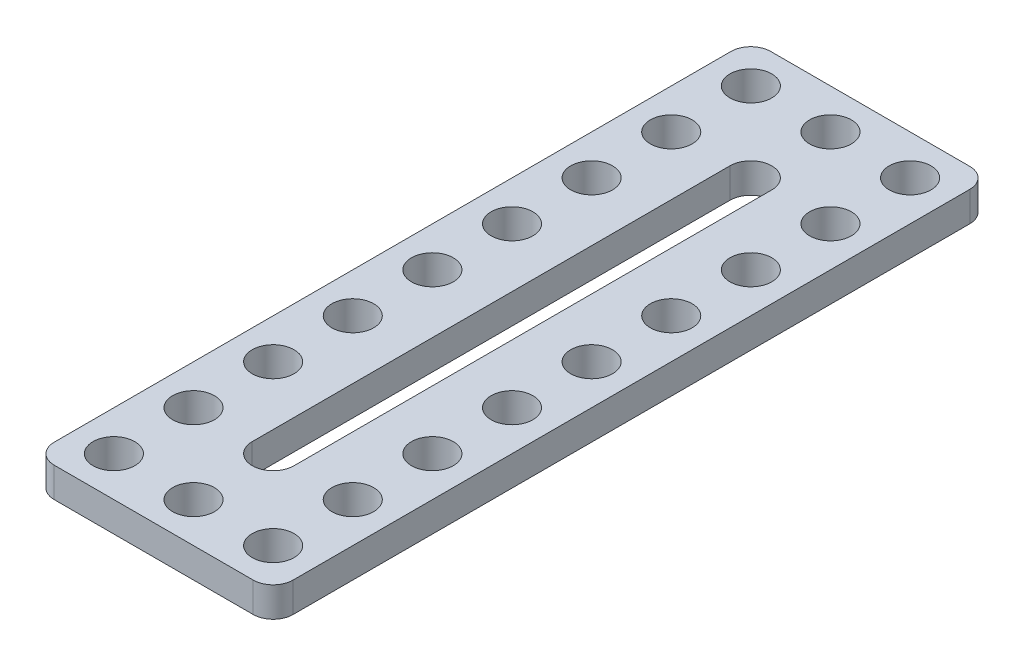
ISO-10303-21;
HEADER;
FILE_DESCRIPTION(('STEP AP214'),'2;1');
FILE_NAME('part.step','',(''),(''),'','','');
FILE_SCHEMA(('AUTOMOTIVE_DESIGN { 1 0 10303 214 1 1 1 1 }'));
ENDSEC;
DATA;
#1=APPLICATION_CONTEXT('core data for automotive mechanical design processes');
#2=APPLICATION_PROTOCOL_DEFINITION('international standard','automotive_design',2000,#1);
#3=PRODUCT_CONTEXT('',#1,'mechanical');
#4=PRODUCT('Part','Part','',(#3));
#5=PRODUCT_RELATED_PRODUCT_CATEGORY('part','',(#4));
#6=PRODUCT_DEFINITION_FORMATION('','',#4);
#7=PRODUCT_DEFINITION_CONTEXT('part definition',#1,'design');
#8=PRODUCT_DEFINITION('design','',#6,#7);
#9=PRODUCT_DEFINITION_SHAPE('','',#8);
#10=(LENGTH_UNIT() NAMED_UNIT(*) SI_UNIT(.MILLI.,.METRE.));
#11=(NAMED_UNIT(*) PLANE_ANGLE_UNIT() SI_UNIT($,.RADIAN.));
#12=(NAMED_UNIT(*) SI_UNIT($,.STERADIAN.) SOLID_ANGLE_UNIT());
#13=UNCERTAINTY_MEASURE_WITH_UNIT(LENGTH_MEASURE(1.E-05),#10,'distance_accuracy_value','');
#14=(GEOMETRIC_REPRESENTATION_CONTEXT(3) GLOBAL_UNCERTAINTY_ASSIGNED_CONTEXT((#13)) GLOBAL_UNIT_ASSIGNED_CONTEXT((#10,
#11,#12)) REPRESENTATION_CONTEXT('',''));
#15=CARTESIAN_POINT('',(0.,0.,0.));
#16=DIRECTION('',(0.,0.,1.));
#17=DIRECTION('',(1.,0.,0.));
#18=AXIS2_PLACEMENT_3D('',#15,#16,#17);
#19=CARTESIAN_POINT('',(12.,3.,-36.));
#20=DIRECTION('',(-1.,0.,0.));
#21=DIRECTION('',(0.,0.,1.));
#22=AXIS2_PLACEMENT_3D('',#19,#20,#21);
#23=PLANE('',#22);
#24=DIRECTION('',(0.,0.,-1.));
#25=VECTOR('',#24,1.);
#26=CARTESIAN_POINT('',(12.,3.,-36.));
#27=LINE('',#26,#25);
#28=CARTESIAN_POINT('',(12.,3.,34.));
#29=VERTEX_POINT('',#28);
#30=CARTESIAN_POINT('',(12.,3.,-34.));
#31=VERTEX_POINT('',#30);
#32=EDGE_CURVE('E291',#29,#31,#27,.T.);
#33=ORIENTED_EDGE('',*,*,#32,.F.);
#34=DIRECTION('',(0.,-1.,0.));
#35=VECTOR('',#34,1.);
#36=CARTESIAN_POINT('',(12.,3.,34.));
#37=LINE('',#36,#35);
#38=CARTESIAN_POINT('',(12.,0.,34.));
#39=VERTEX_POINT('',#38);
#40=EDGE_CURVE('E313',#29,#39,#37,.T.);
#41=ORIENTED_EDGE('',*,*,#40,.T.);
#42=DIRECTION('',(0.,0.,-1.));
#43=VECTOR('',#42,1.);
#44=CARTESIAN_POINT('',(12.,0.,-36.));
#45=LINE('',#44,#43);
#46=CARTESIAN_POINT('',(12.,0.,-34.));
#47=VERTEX_POINT('',#46);
#48=EDGE_CURVE('E288',#39,#47,#45,.T.);
#49=ORIENTED_EDGE('',*,*,#48,.T.);
#50=DIRECTION('',(0.,-1.,0.));
#51=VECTOR('',#50,1.);
#52=CARTESIAN_POINT('',(12.,3.,-34.));
#53=LINE('',#52,#51);
#54=EDGE_CURVE('E302',#47,#31,#53,.F.);
#55=ORIENTED_EDGE('',*,*,#54,.T.);
#56=EDGE_LOOP('',(#33,#41,#49,#55));
#57=FACE_BOUND('',#56,.T.);
#58=ADVANCED_FACE('F36',(#57),#23,.F.);
#59=CARTESIAN_POINT('',(-12.,3.,-36.));
#60=DIRECTION('',(0.,0.,1.));
#61=DIRECTION('',(1.,0.,0.));
#62=AXIS2_PLACEMENT_3D('',#59,#60,#61);
#63=PLANE('',#62);
#64=DIRECTION('',(-1.,0.,0.));
#65=VECTOR('',#64,1.);
#66=CARTESIAN_POINT('',(-12.,3.,-36.));
#67=LINE('',#66,#65);
#68=CARTESIAN_POINT('',(9.99999999999997,3.,-36.));
#69=VERTEX_POINT('',#68);
#70=CARTESIAN_POINT('',(-10.,3.,-36.));
#71=VERTEX_POINT('',#70);
#72=EDGE_CURVE('E294',#69,#71,#67,.T.);
#73=ORIENTED_EDGE('',*,*,#72,.F.);
#74=DIRECTION('',(0.,-1.,0.));
#75=VECTOR('',#74,1.);
#76=CARTESIAN_POINT('',(9.99999999999997,3.,-36.));
#77=LINE('',#76,#75);
#78=CARTESIAN_POINT('',(9.99999999999997,0.,-36.));
#79=VERTEX_POINT('',#78);
#80=EDGE_CURVE('E11',#69,#79,#77,.T.);
#81=ORIENTED_EDGE('',*,*,#80,.T.);
#82=DIRECTION('',(-1.,0.,0.));
#83=VECTOR('',#82,1.);
#84=CARTESIAN_POINT('',(-12.,0.,-36.));
#85=LINE('',#84,#83);
#86=CARTESIAN_POINT('',(-10.,0.,-36.));
#87=VERTEX_POINT('',#86);
#88=EDGE_CURVE('E305',#79,#87,#85,.T.);
#89=ORIENTED_EDGE('',*,*,#88,.T.);
#90=DIRECTION('',(0.,-1.,0.));
#91=VECTOR('',#90,1.);
#92=CARTESIAN_POINT('',(-10.,3.,-36.));
#93=LINE('',#92,#91);
#94=EDGE_CURVE('E44',#87,#71,#93,.F.);
#95=ORIENTED_EDGE('',*,*,#94,.T.);
#96=EDGE_LOOP('',(#73,#81,#89,#95));
#97=FACE_BOUND('',#96,.T.);
#98=ADVANCED_FACE('F342',(#97),#63,.F.);
#99=CARTESIAN_POINT('',(-12.,3.,-36.));
#100=DIRECTION('',(1.,0.,0.));
#101=DIRECTION('',(0.,0.,-1.));
#102=AXIS2_PLACEMENT_3D('',#99,#100,#101);
#103=PLANE('',#102);
#104=DIRECTION('',(0.,0.,1.));
#105=VECTOR('',#104,1.);
#106=CARTESIAN_POINT('',(-12.,0.,-36.));
#107=LINE('',#106,#105);
#108=CARTESIAN_POINT('',(-12.,0.,-34.));
#109=VERTEX_POINT('',#108);
#110=CARTESIAN_POINT('',(-12.,0.,34.));
#111=VERTEX_POINT('',#110);
#112=EDGE_CURVE('E308',#109,#111,#107,.T.);
#113=ORIENTED_EDGE('',*,*,#112,.T.);
#114=DIRECTION('',(0.,-1.,0.));
#115=VECTOR('',#114,1.);
#116=CARTESIAN_POINT('',(-12.,3.,34.));
#117=LINE('',#116,#115);
#118=CARTESIAN_POINT('',(-12.,3.,34.));
#119=VERTEX_POINT('',#118);
#120=EDGE_CURVE('E51',#111,#119,#117,.F.);
#121=ORIENTED_EDGE('',*,*,#120,.T.);
#122=DIRECTION('',(0.,0.,1.));
#123=VECTOR('',#122,1.);
#124=CARTESIAN_POINT('',(-12.,3.,-36.));
#125=LINE('',#124,#123);
#126=CARTESIAN_POINT('',(-12.,3.,-34.));
#127=VERTEX_POINT('',#126);
#128=EDGE_CURVE('E297',#127,#119,#125,.T.);
#129=ORIENTED_EDGE('',*,*,#128,.F.);
#130=DIRECTION('',(0.,-1.,0.));
#131=VECTOR('',#130,1.);
#132=CARTESIAN_POINT('',(-12.,3.,-34.));
#133=LINE('',#132,#131);
#134=EDGE_CURVE('E336',#127,#109,#133,.T.);
#135=ORIENTED_EDGE('',*,*,#134,.T.);
#136=EDGE_LOOP('',(#113,#121,#129,#135));
#137=FACE_BOUND('',#136,.T.);
#138=ADVANCED_FACE('F350',(#137),#103,.F.);
#139=CARTESIAN_POINT('',(-12.,3.,36.));
#140=DIRECTION('',(0.,0.,-1.));
#141=DIRECTION('',(-1.,0.,0.));
#142=AXIS2_PLACEMENT_3D('',#139,#140,#141);
#143=PLANE('',#142);
#144=DIRECTION('',(1.,0.,0.));
#145=VECTOR('',#144,1.);
#146=CARTESIAN_POINT('',(-12.,0.,36.));
#147=LINE('',#146,#145);
#148=CARTESIAN_POINT('',(-9.99999999999999,0.,36.));
#149=VERTEX_POINT('',#148);
#150=CARTESIAN_POINT('',(10.,0.,36.));
#151=VERTEX_POINT('',#150);
#152=EDGE_CURVE('E295',#149,#151,#147,.T.);
#153=ORIENTED_EDGE('',*,*,#152,.T.);
#154=DIRECTION('',(0.,-1.,0.));
#155=VECTOR('',#154,1.);
#156=CARTESIAN_POINT('',(10.,3.,36.));
#157=LINE('',#156,#155);
#158=CARTESIAN_POINT('',(10.,3.,36.));
#159=VERTEX_POINT('',#158);
#160=EDGE_CURVE('E327',#151,#159,#157,.F.);
#161=ORIENTED_EDGE('',*,*,#160,.T.);
#162=DIRECTION('',(1.,0.,0.));
#163=VECTOR('',#162,1.);
#164=CARTESIAN_POINT('',(-12.,3.,36.));
#165=LINE('',#164,#163);
#166=CARTESIAN_POINT('',(-9.99999999999999,3.,36.));
#167=VERTEX_POINT('',#166);
#168=EDGE_CURVE('E299',#167,#159,#165,.T.);
#169=ORIENTED_EDGE('',*,*,#168,.F.);
#170=DIRECTION('',(0.,-1.,0.));
#171=VECTOR('',#170,1.);
#172=CARTESIAN_POINT('',(-9.99999999999999,3.,36.));
#173=LINE('',#172,#171);
#174=EDGE_CURVE('E324',#167,#149,#173,.T.);
#175=ORIENTED_EDGE('',*,*,#174,.T.);
#176=EDGE_LOOP('',(#153,#161,#169,#175));
#177=FACE_BOUND('',#176,.T.);
#178=ADVANCED_FACE('F360',(#177),#143,.F.);
#179=CARTESIAN_POINT('',(0.,3.,0.));
#180=DIRECTION('',(0.,1.,0.));
#181=DIRECTION('',(0.,0.,1.));
#182=AXIS2_PLACEMENT_3D('',#179,#180,#181);
#183=PLANE('',#182);
#184=CARTESIAN_POINT('',(0.,3.,24.));
#185=DIRECTION('',(0.,1.,0.));
#186=DIRECTION('',(0.,0.,1.));
#187=AXIS2_PLACEMENT_3D('',#184,#185,#186);
#188=CIRCLE('',#187,2.1);
#189=CARTESIAN_POINT('',(-2.1,3.,24.));
#190=VERTEX_POINT('',#189);
#191=CARTESIAN_POINT('',(2.1,3.,24.));
#192=VERTEX_POINT('',#191);
#193=EDGE_CURVE('E134',#190,#192,#188,.T.);
#194=ORIENTED_EDGE('',*,*,#193,.F.);
#195=DIRECTION('',(0.,0.,1.));
#196=VECTOR('',#195,1.);
#197=CARTESIAN_POINT('',(-2.1,3.,24.));
#198=LINE('',#197,#196);
#199=CARTESIAN_POINT('',(-2.1,3.,-24.));
#200=VERTEX_POINT('',#199);
#201=EDGE_CURVE('E152',#200,#190,#198,.T.);
#202=ORIENTED_EDGE('',*,*,#201,.F.);
#203=CARTESIAN_POINT('',(0.,3.,-24.));
#204=DIRECTION('',(0.,1.,0.));
#205=DIRECTION('',(0.,0.,-1.));
#206=AXIS2_PLACEMENT_3D('',#203,#204,#205);
#207=CIRCLE('',#206,2.1);
#208=CARTESIAN_POINT('',(2.1,3.,-24.));
#209=VERTEX_POINT('',#208);
#210=EDGE_CURVE('E155',#209,#200,#207,.T.);
#211=ORIENTED_EDGE('',*,*,#210,.F.);
#212=DIRECTION('',(0.,0.,-1.));
#213=VECTOR('',#212,1.);
#214=CARTESIAN_POINT('',(2.1,3.,24.));
#215=LINE('',#214,#213);
#216=EDGE_CURVE('E161',#192,#209,#215,.T.);
#217=ORIENTED_EDGE('',*,*,#216,.F.);
#218=EDGE_LOOP('',(#194,#202,#211,#217));
#219=FACE_BOUND('',#218,.T.);
#220=CARTESIAN_POINT('',(8.00000000000007,3.,16.));
#221=DIRECTION('',(0.,1.,0.));
#222=DIRECTION('',(0.,0.,-1.));
#223=AXIS2_PLACEMENT_3D('',#220,#221,#222);
#224=CIRCLE('',#223,2.1);
#225=CARTESIAN_POINT('',(8.00000000000007,3.,13.9));
#226=VERTEX_POINT('',#225);
#227=EDGE_CURVE('E205',#226,#226,#224,.T.);
#228=ORIENTED_EDGE('',*,*,#227,.F.);
#229=EDGE_LOOP('',(#228));
#230=FACE_BOUND('',#229,.T.);
#231=CARTESIAN_POINT('',(8.00000000000009,3.,7.99999999999999));
#232=DIRECTION('',(0.,1.,0.));
#233=DIRECTION('',(0.,0.,-1.));
#234=AXIS2_PLACEMENT_3D('',#231,#232,#233);
#235=CIRCLE('',#234,2.1);
#236=CARTESIAN_POINT('',(8.00000000000009,3.,5.9));
#237=VERTEX_POINT('',#236);
#238=EDGE_CURVE('E211',#237,#237,#235,.T.);
#239=ORIENTED_EDGE('',*,*,#238,.F.);
#240=EDGE_LOOP('',(#239));
#241=FACE_BOUND('',#240,.T.);
#242=CARTESIAN_POINT('',(8.00000000000012,3.,0.));
#243=DIRECTION('',(0.,1.,0.));
#244=DIRECTION('',(0.,0.,-1.));
#245=AXIS2_PLACEMENT_3D('',#242,#243,#244);
#246=CIRCLE('',#245,2.1);
#247=CARTESIAN_POINT('',(8.00000000000012,3.,-2.1));
#248=VERTEX_POINT('',#247);
#249=EDGE_CURVE('E217',#248,#248,#246,.T.);
#250=ORIENTED_EDGE('',*,*,#249,.F.);
#251=EDGE_LOOP('',(#250));
#252=FACE_BOUND('',#251,.T.);
#253=CARTESIAN_POINT('',(8.00000000000014,3.,-8.00000000000001));
#254=DIRECTION('',(0.,1.,0.));
#255=DIRECTION('',(0.,0.,-1.));
#256=AXIS2_PLACEMENT_3D('',#253,#254,#255);
#257=CIRCLE('',#256,2.1);
#258=CARTESIAN_POINT('',(8.00000000000014,3.,-10.1));
#259=VERTEX_POINT('',#258);
#260=EDGE_CURVE('E223',#259,#259,#257,.T.);
#261=ORIENTED_EDGE('',*,*,#260,.F.);
#262=EDGE_LOOP('',(#261));
#263=FACE_BOUND('',#262,.T.);
#264=CARTESIAN_POINT('',(8.00000000000016,3.,-16.));
#265=DIRECTION('',(0.,1.,0.));
#266=DIRECTION('',(0.,0.,-1.));
#267=AXIS2_PLACEMENT_3D('',#264,#265,#266);
#268=CIRCLE('',#267,2.1);
#269=CARTESIAN_POINT('',(8.00000000000016,3.,-18.1));
#270=VERTEX_POINT('',#269);
#271=EDGE_CURVE('E192',#270,#270,#268,.T.);
#272=ORIENTED_EDGE('',*,*,#271,.F.);
#273=EDGE_LOOP('',(#272));
#274=FACE_BOUND('',#273,.T.);
#275=CARTESIAN_POINT('',(0.,3.,-32.0000000000001));
#276=DIRECTION('',(0.,1.,0.));
#277=DIRECTION('',(0.,0.,1.));
#278=AXIS2_PLACEMENT_3D('',#275,#276,#277);
#279=CIRCLE('',#278,2.1);
#280=CARTESIAN_POINT('',(0.,3.,-29.9000000000001));
#281=VERTEX_POINT('',#280);
#282=EDGE_CURVE('E167',#281,#281,#279,.T.);
#283=ORIENTED_EDGE('',*,*,#282,.F.);
#284=EDGE_LOOP('',(#283));
#285=FACE_BOUND('',#284,.T.);
#286=CARTESIAN_POINT('',(0.,3.,32.));
#287=DIRECTION('',(0.,1.,0.));
#288=DIRECTION('',(0.,0.,-1.));
#289=AXIS2_PLACEMENT_3D('',#286,#287,#288);
#290=CIRCLE('',#289,2.1);
#291=CARTESIAN_POINT('',(0.,3.,29.9000000000001));
#292=VERTEX_POINT('',#291);
#293=EDGE_CURVE('E181',#292,#292,#290,.T.);
#294=ORIENTED_EDGE('',*,*,#293,.F.);
#295=EDGE_LOOP('',(#294));
#296=FACE_BOUND('',#295,.T.);
#297=CARTESIAN_POINT('',(8.00000000000003,3.,32.));
#298=DIRECTION('',(0.,1.,0.));
#299=DIRECTION('',(0.,0.,-1.));
#300=AXIS2_PLACEMENT_3D('',#297,#298,#299);
#301=CIRCLE('',#300,2.1);
#302=CARTESIAN_POINT('',(8.00000000000003,3.,29.9));
#303=VERTEX_POINT('',#302);
#304=EDGE_CURVE('E175',#303,#303,#301,.T.);
#305=ORIENTED_EDGE('',*,*,#304,.F.);
#306=EDGE_LOOP('',(#305));
#307=FACE_BOUND('',#306,.T.);
#308=CARTESIAN_POINT('',(8.0000000000002,3.,-32.));
#309=DIRECTION('',(0.,1.,0.));
#310=DIRECTION('',(0.,0.,-1.));
#311=AXIS2_PLACEMENT_3D('',#308,#309,#310);
#312=CIRCLE('',#311,2.1);
#313=CARTESIAN_POINT('',(8.0000000000002,3.,-34.1));
#314=VERTEX_POINT('',#313);
#315=EDGE_CURVE('E174',#314,#314,#312,.T.);
#316=ORIENTED_EDGE('',*,*,#315,.F.);
#317=EDGE_LOOP('',(#316));
#318=FACE_BOUND('',#317,.T.);
#319=CARTESIAN_POINT('',(8.00000000000018,3.,-24.));
#320=DIRECTION('',(0.,1.,0.));
#321=DIRECTION('',(0.,0.,-1.));
#322=AXIS2_PLACEMENT_3D('',#319,#320,#321);
#323=CIRCLE('',#322,2.1);
#324=CARTESIAN_POINT('',(8.00000000000018,3.,-26.1));
#325=VERTEX_POINT('',#324);
#326=EDGE_CURVE('E193',#325,#325,#323,.T.);
#327=ORIENTED_EDGE('',*,*,#326,.F.);
#328=EDGE_LOOP('',(#327));
#329=FACE_BOUND('',#328,.T.);
#330=CARTESIAN_POINT('',(-8.00000000000024,3.,-32.));
#331=DIRECTION('',(0.,1.,0.));
#332=DIRECTION('',(0.,0.,1.));
#333=AXIS2_PLACEMENT_3D('',#330,#331,#332);
#334=CIRCLE('',#333,2.1);
#335=CARTESIAN_POINT('',(-8.00000000000024,3.,-29.9));
#336=VERTEX_POINT('',#335);
#337=EDGE_CURVE('E204',#336,#336,#334,.T.);
#338=ORIENTED_EDGE('',*,*,#337,.F.);
#339=EDGE_LOOP('',(#338));
#340=FACE_BOUND('',#339,.T.);
#341=CARTESIAN_POINT('',(-8.00000000000021,3.,-24.));
#342=DIRECTION('',(0.,1.,0.));
#343=DIRECTION('',(0.,0.,1.));
#344=AXIS2_PLACEMENT_3D('',#341,#342,#343);
#345=CIRCLE('',#344,2.1);
#346=CARTESIAN_POINT('',(-8.00000000000021,3.,-21.9));
#347=VERTEX_POINT('',#346);
#348=EDGE_CURVE('E277',#347,#347,#345,.T.);
#349=ORIENTED_EDGE('',*,*,#348,.F.);
#350=EDGE_LOOP('',(#349));
#351=FACE_BOUND('',#350,.T.);
#352=CARTESIAN_POINT('',(-8.00000000000019,3.,-16.));
#353=DIRECTION('',(0.,1.,0.));
#354=DIRECTION('',(0.,0.,1.));
#355=AXIS2_PLACEMENT_3D('',#352,#353,#354);
#356=CIRCLE('',#355,2.1);
#357=CARTESIAN_POINT('',(-8.00000000000019,3.,-13.9));
#358=VERTEX_POINT('',#357);
#359=EDGE_CURVE('E271',#358,#358,#356,.T.);
#360=ORIENTED_EDGE('',*,*,#359,.F.);
#361=EDGE_LOOP('',(#360));
#362=FACE_BOUND('',#361,.T.);
#363=CARTESIAN_POINT('',(-8.00000000000016,3.,-8.00000000000001));
#364=DIRECTION('',(0.,1.,0.));
#365=DIRECTION('',(0.,0.,1.));
#366=AXIS2_PLACEMENT_3D('',#363,#364,#365);
#367=CIRCLE('',#366,2.1);
#368=CARTESIAN_POINT('',(-8.00000000000016,3.,-5.90000000000001));
#369=VERTEX_POINT('',#368);
#370=EDGE_CURVE('E265',#369,#369,#367,.T.);
#371=ORIENTED_EDGE('',*,*,#370,.F.);
#372=EDGE_LOOP('',(#371));
#373=FACE_BOUND('',#372,.T.);
#374=CARTESIAN_POINT('',(-8.00000000000013,3.,0.));
#375=DIRECTION('',(0.,1.,0.));
#376=DIRECTION('',(0.,0.,1.));
#377=AXIS2_PLACEMENT_3D('',#374,#375,#376);
#378=CIRCLE('',#377,2.1);
#379=CARTESIAN_POINT('',(-8.00000000000013,3.,2.09999999999999));
#380=VERTEX_POINT('',#379);
#381=EDGE_CURVE('E259',#380,#380,#378,.T.);
#382=ORIENTED_EDGE('',*,*,#381,.F.);
#383=EDGE_LOOP('',(#382));
#384=FACE_BOUND('',#383,.T.);
#385=CARTESIAN_POINT('',(-8.0000000000001,3.,7.99999999999999));
#386=DIRECTION('',(0.,1.,0.));
#387=DIRECTION('',(0.,0.,1.));
#388=AXIS2_PLACEMENT_3D('',#385,#386,#387);
#389=CIRCLE('',#388,2.1);
#390=CARTESIAN_POINT('',(-8.0000000000001,3.,10.1));
#391=VERTEX_POINT('',#390);
#392=EDGE_CURVE('E253',#391,#391,#389,.T.);
#393=ORIENTED_EDGE('',*,*,#392,.F.);
#394=EDGE_LOOP('',(#393));
#395=FACE_BOUND('',#394,.T.);
#396=CARTESIAN_POINT('',(-8.00000000000007,3.,16.));
#397=DIRECTION('',(0.,1.,0.));
#398=DIRECTION('',(0.,0.,1.));
#399=AXIS2_PLACEMENT_3D('',#396,#397,#398);
#400=CIRCLE('',#399,2.1);
#401=CARTESIAN_POINT('',(-8.00000000000007,3.,18.1));
#402=VERTEX_POINT('',#401);
#403=EDGE_CURVE('E247',#402,#402,#400,.T.);
#404=ORIENTED_EDGE('',*,*,#403,.F.);
#405=EDGE_LOOP('',(#404));
#406=FACE_BOUND('',#405,.T.);
#407=CARTESIAN_POINT('',(-8.00000000000004,3.,24.));
#408=DIRECTION('',(0.,1.,0.));
#409=DIRECTION('',(0.,0.,1.));
#410=AXIS2_PLACEMENT_3D('',#407,#408,#409);
#411=CIRCLE('',#410,2.1);
#412=CARTESIAN_POINT('',(-8.00000000000004,3.,26.1));
#413=VERTEX_POINT('',#412);
#414=EDGE_CURVE('E241',#413,#413,#411,.T.);
#415=ORIENTED_EDGE('',*,*,#414,.F.);
#416=EDGE_LOOP('',(#415));
#417=FACE_BOUND('',#416,.T.);
#418=CARTESIAN_POINT('',(8.00000000000005,3.,24.));
#419=DIRECTION('',(0.,1.,0.));
#420=DIRECTION('',(0.,0.,-1.));
#421=AXIS2_PLACEMENT_3D('',#418,#419,#420);
#422=CIRCLE('',#421,2.1);
#423=CARTESIAN_POINT('',(8.00000000000005,3.,21.9));
#424=VERTEX_POINT('',#423);
#425=EDGE_CURVE('E235',#424,#424,#422,.T.);
#426=ORIENTED_EDGE('',*,*,#425,.F.);
#427=EDGE_LOOP('',(#426));
#428=FACE_BOUND('',#427,.T.);
#429=CARTESIAN_POINT('',(-8.00000000000002,3.,32.));
#430=DIRECTION('',(0.,1.,0.));
#431=DIRECTION('',(0.,0.,1.));
#432=AXIS2_PLACEMENT_3D('',#429,#430,#431);
#433=CIRCLE('',#432,2.1);
#434=CARTESIAN_POINT('',(-8.00000000000002,3.,34.1));
#435=VERTEX_POINT('',#434);
#436=EDGE_CURVE('E234',#435,#435,#433,.T.);
#437=ORIENTED_EDGE('',*,*,#436,.F.);
#438=EDGE_LOOP('',(#437));
#439=FACE_BOUND('',#438,.T.);
#440=ORIENTED_EDGE('',*,*,#168,.T.);
#441=CARTESIAN_POINT('',(10.,3.,34.));
#442=DIRECTION('',(0.,1.,0.));
#443=DIRECTION('',(0.,0.,1.));
#444=AXIS2_PLACEMENT_3D('',#441,#442,#443);
#445=CIRCLE('',#444,2.);
#446=EDGE_CURVE('E334',#159,#29,#445,.T.);
#447=ORIENTED_EDGE('',*,*,#446,.T.);
#448=ORIENTED_EDGE('',*,*,#32,.T.);
#449=CARTESIAN_POINT('',(9.99999999999997,3.,-34.));
#450=DIRECTION('',(0.,1.,0.));
#451=DIRECTION('',(0.,0.,1.));
#452=AXIS2_PLACEMENT_3D('',#449,#450,#451);
#453=CIRCLE('',#452,2.);
#454=EDGE_CURVE('E330',#31,#69,#453,.T.);
#455=ORIENTED_EDGE('',*,*,#454,.T.);
#456=ORIENTED_EDGE('',*,*,#72,.T.);
#457=CARTESIAN_POINT('',(-10.,3.,-34.));
#458=DIRECTION('',(0.,1.,0.));
#459=DIRECTION('',(0.,0.,1.));
#460=AXIS2_PLACEMENT_3D('',#457,#458,#459);
#461=CIRCLE('',#460,2.);
#462=EDGE_CURVE('E58',#71,#127,#461,.T.);
#463=ORIENTED_EDGE('',*,*,#462,.T.);
#464=ORIENTED_EDGE('',*,*,#128,.T.);
#465=CARTESIAN_POINT('',(-9.99999999999999,3.,34.));
#466=DIRECTION('',(0.,1.,0.));
#467=DIRECTION('',(0.,0.,1.));
#468=AXIS2_PLACEMENT_3D('',#465,#466,#467);
#469=CIRCLE('',#468,2.);
#470=EDGE_CURVE('E332',#119,#167,#469,.T.);
#471=ORIENTED_EDGE('',*,*,#470,.T.);
#472=EDGE_LOOP('',(#440,#447,#448,#455,#456,#463,#464,#471));
#473=FACE_BOUND('',#472,.T.);
#474=ADVANCED_FACE('F346',(#219,#230,#241,#252,#263,#274,#285,#296,#307,#318,#329,#340,#351,
#362,#373,#384,#395,#406,#417,#428,#439,#473),#183,.T.);
#475=CARTESIAN_POINT('',(0.,0.,0.));
#476=DIRECTION('',(0.,1.,0.));
#477=DIRECTION('',(0.,0.,1.));
#478=AXIS2_PLACEMENT_3D('',#475,#476,#477);
#479=PLANE('',#478);
#480=DIRECTION('',(0.,0.,1.));
#481=VECTOR('',#480,1.);
#482=CARTESIAN_POINT('',(-2.1,0.,24.));
#483=LINE('',#482,#481);
#484=CARTESIAN_POINT('',(-2.1,0.,-24.));
#485=VERTEX_POINT('',#484);
#486=CARTESIAN_POINT('',(-2.1,0.,24.));
#487=VERTEX_POINT('',#486);
#488=EDGE_CURVE('E139',#485,#487,#483,.T.);
#489=ORIENTED_EDGE('',*,*,#488,.T.);
#490=CARTESIAN_POINT('',(0.,0.,24.));
#491=DIRECTION('',(0.,1.,0.));
#492=DIRECTION('',(0.,0.,1.));
#493=AXIS2_PLACEMENT_3D('',#490,#491,#492);
#494=CIRCLE('',#493,2.1);
#495=CARTESIAN_POINT('',(2.1,0.,24.));
#496=VERTEX_POINT('',#495);
#497=EDGE_CURVE('E131',#487,#496,#494,.T.);
#498=ORIENTED_EDGE('',*,*,#497,.T.);
#499=DIRECTION('',(0.,0.,-1.));
#500=VECTOR('',#499,1.);
#501=CARTESIAN_POINT('',(2.1,0.,24.));
#502=LINE('',#501,#500);
#503=CARTESIAN_POINT('',(2.1,0.,-24.));
#504=VERTEX_POINT('',#503);
#505=EDGE_CURVE('E143',#496,#504,#502,.T.);
#506=ORIENTED_EDGE('',*,*,#505,.T.);
#507=CARTESIAN_POINT('',(0.,0.,-24.));
#508=DIRECTION('',(0.,1.,0.));
#509=DIRECTION('',(0.,0.,-1.));
#510=AXIS2_PLACEMENT_3D('',#507,#508,#509);
#511=CIRCLE('',#510,2.1);
#512=EDGE_CURVE('E147',#504,#485,#511,.T.);
#513=ORIENTED_EDGE('',*,*,#512,.T.);
#514=EDGE_LOOP('',(#489,#498,#506,#513));
#515=FACE_BOUND('',#514,.T.);
#516=CARTESIAN_POINT('',(8.00000000000007,0.,16.));
#517=DIRECTION('',(0.,1.,0.));
#518=DIRECTION('',(0.,0.,-1.));
#519=AXIS2_PLACEMENT_3D('',#516,#517,#518);
#520=CIRCLE('',#519,2.1);
#521=CARTESIAN_POINT('',(8.00000000000007,0.,13.9));
#522=VERTEX_POINT('',#521);
#523=EDGE_CURVE('E201',#522,#522,#520,.T.);
#524=ORIENTED_EDGE('',*,*,#523,.T.);
#525=EDGE_LOOP('',(#524));
#526=FACE_BOUND('',#525,.T.);
#527=CARTESIAN_POINT('',(8.00000000000009,0.,7.99999999999999));
#528=DIRECTION('',(0.,1.,0.));
#529=DIRECTION('',(0.,0.,-1.));
#530=AXIS2_PLACEMENT_3D('',#527,#528,#529);
#531=CIRCLE('',#530,2.1);
#532=CARTESIAN_POINT('',(8.00000000000009,0.,5.9));
#533=VERTEX_POINT('',#532);
#534=EDGE_CURVE('E208',#533,#533,#531,.T.);
#535=ORIENTED_EDGE('',*,*,#534,.T.);
#536=EDGE_LOOP('',(#535));
#537=FACE_BOUND('',#536,.T.);
#538=CARTESIAN_POINT('',(8.00000000000012,0.,0.));
#539=DIRECTION('',(0.,1.,0.));
#540=DIRECTION('',(0.,0.,-1.));
#541=AXIS2_PLACEMENT_3D('',#538,#539,#540);
#542=CIRCLE('',#541,2.1);
#543=CARTESIAN_POINT('',(8.00000000000012,0.,-2.1));
#544=VERTEX_POINT('',#543);
#545=EDGE_CURVE('E214',#544,#544,#542,.T.);
#546=ORIENTED_EDGE('',*,*,#545,.T.);
#547=EDGE_LOOP('',(#546));
#548=FACE_BOUND('',#547,.T.);
#549=CARTESIAN_POINT('',(8.00000000000014,0.,-8.00000000000001));
#550=DIRECTION('',(0.,1.,0.));
#551=DIRECTION('',(0.,0.,-1.));
#552=AXIS2_PLACEMENT_3D('',#549,#550,#551);
#553=CIRCLE('',#552,2.1);
#554=CARTESIAN_POINT('',(8.00000000000014,0.,-10.1));
#555=VERTEX_POINT('',#554);
#556=EDGE_CURVE('E220',#555,#555,#553,.T.);
#557=ORIENTED_EDGE('',*,*,#556,.T.);
#558=EDGE_LOOP('',(#557));
#559=FACE_BOUND('',#558,.T.);
#560=CARTESIAN_POINT('',(8.00000000000016,0.,-16.));
#561=DIRECTION('',(0.,1.,0.));
#562=DIRECTION('',(0.,0.,-1.));
#563=AXIS2_PLACEMENT_3D('',#560,#561,#562);
#564=CIRCLE('',#563,2.1);
#565=CARTESIAN_POINT('',(8.00000000000016,0.,-18.1));
#566=VERTEX_POINT('',#565);
#567=EDGE_CURVE('E226',#566,#566,#564,.T.);
#568=ORIENTED_EDGE('',*,*,#567,.T.);
#569=EDGE_LOOP('',(#568));
#570=FACE_BOUND('',#569,.T.);
#571=CARTESIAN_POINT('',(0.,0.,-32.0000000000001));
#572=DIRECTION('',(0.,1.,0.));
#573=DIRECTION('',(0.,0.,1.));
#574=AXIS2_PLACEMENT_3D('',#571,#572,#573);
#575=CIRCLE('',#574,2.1);
#576=CARTESIAN_POINT('',(0.,0.,-29.9000000000001));
#577=VERTEX_POINT('',#576);
#578=EDGE_CURVE('E184',#577,#577,#575,.T.);
#579=ORIENTED_EDGE('',*,*,#578,.T.);
#580=EDGE_LOOP('',(#579));
#581=FACE_BOUND('',#580,.T.);
#582=CARTESIAN_POINT('',(0.,0.,32.));
#583=DIRECTION('',(0.,1.,0.));
#584=DIRECTION('',(0.,0.,-1.));
#585=AXIS2_PLACEMENT_3D('',#582,#583,#584);
#586=CIRCLE('',#585,2.1);
#587=CARTESIAN_POINT('',(0.,0.,29.9000000000001));
#588=VERTEX_POINT('',#587);
#589=EDGE_CURVE('E178',#588,#588,#586,.T.);
#590=ORIENTED_EDGE('',*,*,#589,.T.);
#591=EDGE_LOOP('',(#590));
#592=FACE_BOUND('',#591,.T.);
#593=CARTESIAN_POINT('',(8.00000000000003,0.,32.));
#594=DIRECTION('',(0.,1.,0.));
#595=DIRECTION('',(0.,0.,-1.));
#596=AXIS2_PLACEMENT_3D('',#593,#594,#595);
#597=CIRCLE('',#596,2.1);
#598=CARTESIAN_POINT('',(8.00000000000003,0.,29.9));
#599=VERTEX_POINT('',#598);
#600=EDGE_CURVE('E171',#599,#599,#597,.T.);
#601=ORIENTED_EDGE('',*,*,#600,.T.);
#602=EDGE_LOOP('',(#601));
#603=FACE_BOUND('',#602,.T.);
#604=CARTESIAN_POINT('',(8.0000000000002,0.,-32.));
#605=DIRECTION('',(0.,1.,0.));
#606=DIRECTION('',(0.,0.,-1.));
#607=AXIS2_PLACEMENT_3D('',#604,#605,#606);
#608=CIRCLE('',#607,2.1);
#609=CARTESIAN_POINT('',(8.0000000000002,0.,-34.1));
#610=VERTEX_POINT('',#609);
#611=EDGE_CURVE('E196',#610,#610,#608,.T.);
#612=ORIENTED_EDGE('',*,*,#611,.T.);
#613=EDGE_LOOP('',(#612));
#614=FACE_BOUND('',#613,.T.);
#615=CARTESIAN_POINT('',(8.00000000000018,0.,-24.));
#616=DIRECTION('',(0.,1.,0.));
#617=DIRECTION('',(0.,0.,-1.));
#618=AXIS2_PLACEMENT_3D('',#615,#616,#617);
#619=CIRCLE('',#618,2.1);
#620=CARTESIAN_POINT('',(8.00000000000018,0.,-26.1));
#621=VERTEX_POINT('',#620);
#622=EDGE_CURVE('E189',#621,#621,#619,.T.);
#623=ORIENTED_EDGE('',*,*,#622,.T.);
#624=EDGE_LOOP('',(#623));
#625=FACE_BOUND('',#624,.T.);
#626=CARTESIAN_POINT('',(-8.00000000000024,0.,-32.));
#627=DIRECTION('',(0.,1.,0.));
#628=DIRECTION('',(0.,0.,1.));
#629=AXIS2_PLACEMENT_3D('',#626,#627,#628);
#630=CIRCLE('',#629,2.1);
#631=CARTESIAN_POINT('',(-8.00000000000024,0.,-29.9));
#632=VERTEX_POINT('',#631);
#633=EDGE_CURVE('E280',#632,#632,#630,.T.);
#634=ORIENTED_EDGE('',*,*,#633,.T.);
#635=EDGE_LOOP('',(#634));
#636=FACE_BOUND('',#635,.T.);
#637=CARTESIAN_POINT('',(-8.00000000000021,0.,-24.));
#638=DIRECTION('',(0.,1.,0.));
#639=DIRECTION('',(0.,0.,1.));
#640=AXIS2_PLACEMENT_3D('',#637,#638,#639);
#641=CIRCLE('',#640,2.1);
#642=CARTESIAN_POINT('',(-8.00000000000021,0.,-21.9));
#643=VERTEX_POINT('',#642);
#644=EDGE_CURVE('E274',#643,#643,#641,.T.);
#645=ORIENTED_EDGE('',*,*,#644,.T.);
#646=EDGE_LOOP('',(#645));
#647=FACE_BOUND('',#646,.T.);
#648=CARTESIAN_POINT('',(-8.00000000000019,0.,-16.));
#649=DIRECTION('',(0.,1.,0.));
#650=DIRECTION('',(0.,0.,1.));
#651=AXIS2_PLACEMENT_3D('',#648,#649,#650);
#652=CIRCLE('',#651,2.1);
#653=CARTESIAN_POINT('',(-8.00000000000019,0.,-13.9));
#654=VERTEX_POINT('',#653);
#655=EDGE_CURVE('E268',#654,#654,#652,.T.);
#656=ORIENTED_EDGE('',*,*,#655,.T.);
#657=EDGE_LOOP('',(#656));
#658=FACE_BOUND('',#657,.T.);
#659=CARTESIAN_POINT('',(-8.00000000000016,0.,-8.00000000000001));
#660=DIRECTION('',(0.,1.,0.));
#661=DIRECTION('',(0.,0.,1.));
#662=AXIS2_PLACEMENT_3D('',#659,#660,#661);
#663=CIRCLE('',#662,2.1);
#664=CARTESIAN_POINT('',(-8.00000000000016,0.,-5.90000000000001));
#665=VERTEX_POINT('',#664);
#666=EDGE_CURVE('E262',#665,#665,#663,.T.);
#667=ORIENTED_EDGE('',*,*,#666,.T.);
#668=EDGE_LOOP('',(#667));
#669=FACE_BOUND('',#668,.T.);
#670=CARTESIAN_POINT('',(-8.00000000000013,0.,0.));
#671=DIRECTION('',(0.,1.,0.));
#672=DIRECTION('',(0.,0.,1.));
#673=AXIS2_PLACEMENT_3D('',#670,#671,#672);
#674=CIRCLE('',#673,2.1);
#675=CARTESIAN_POINT('',(-8.00000000000013,0.,2.09999999999999));
#676=VERTEX_POINT('',#675);
#677=EDGE_CURVE('E256',#676,#676,#674,.T.);
#678=ORIENTED_EDGE('',*,*,#677,.T.);
#679=EDGE_LOOP('',(#678));
#680=FACE_BOUND('',#679,.T.);
#681=CARTESIAN_POINT('',(-8.0000000000001,0.,7.99999999999999));
#682=DIRECTION('',(0.,1.,0.));
#683=DIRECTION('',(0.,0.,1.));
#684=AXIS2_PLACEMENT_3D('',#681,#682,#683);
#685=CIRCLE('',#684,2.1);
#686=CARTESIAN_POINT('',(-8.0000000000001,0.,10.1));
#687=VERTEX_POINT('',#686);
#688=EDGE_CURVE('E250',#687,#687,#685,.T.);
#689=ORIENTED_EDGE('',*,*,#688,.T.);
#690=EDGE_LOOP('',(#689));
#691=FACE_BOUND('',#690,.T.);
#692=CARTESIAN_POINT('',(-8.00000000000007,0.,16.));
#693=DIRECTION('',(0.,1.,0.));
#694=DIRECTION('',(0.,0.,1.));
#695=AXIS2_PLACEMENT_3D('',#692,#693,#694);
#696=CIRCLE('',#695,2.1);
#697=CARTESIAN_POINT('',(-8.00000000000007,0.,18.1));
#698=VERTEX_POINT('',#697);
#699=EDGE_CURVE('E244',#698,#698,#696,.T.);
#700=ORIENTED_EDGE('',*,*,#699,.T.);
#701=EDGE_LOOP('',(#700));
#702=FACE_BOUND('',#701,.T.);
#703=CARTESIAN_POINT('',(-8.00000000000004,0.,24.));
#704=DIRECTION('',(0.,1.,0.));
#705=DIRECTION('',(0.,0.,1.));
#706=AXIS2_PLACEMENT_3D('',#703,#704,#705);
#707=CIRCLE('',#706,2.1);
#708=CARTESIAN_POINT('',(-8.00000000000004,0.,26.1));
#709=VERTEX_POINT('',#708);
#710=EDGE_CURVE('E238',#709,#709,#707,.T.);
#711=ORIENTED_EDGE('',*,*,#710,.T.);
#712=EDGE_LOOP('',(#711));
#713=FACE_BOUND('',#712,.T.);
#714=CARTESIAN_POINT('',(8.00000000000005,0.,24.));
#715=DIRECTION('',(0.,1.,0.));
#716=DIRECTION('',(0.,0.,-1.));
#717=AXIS2_PLACEMENT_3D('',#714,#715,#716);
#718=CIRCLE('',#717,2.1);
#719=CARTESIAN_POINT('',(8.00000000000005,0.,21.9));
#720=VERTEX_POINT('',#719);
#721=EDGE_CURVE('E231',#720,#720,#718,.T.);
#722=ORIENTED_EDGE('',*,*,#721,.T.);
#723=EDGE_LOOP('',(#722));
#724=FACE_BOUND('',#723,.T.);
#725=CARTESIAN_POINT('',(-8.00000000000002,0.,32.));
#726=DIRECTION('',(0.,1.,0.));
#727=DIRECTION('',(0.,0.,1.));
#728=AXIS2_PLACEMENT_3D('',#725,#726,#727);
#729=CIRCLE('',#728,2.1);
#730=CARTESIAN_POINT('',(-8.00000000000002,0.,34.1));
#731=VERTEX_POINT('',#730);
#732=EDGE_CURVE('E285',#731,#731,#729,.T.);
#733=ORIENTED_EDGE('',*,*,#732,.T.);
#734=EDGE_LOOP('',(#733));
#735=FACE_BOUND('',#734,.T.);
#736=ORIENTED_EDGE('',*,*,#48,.F.);
#737=CARTESIAN_POINT('',(10.,0.,34.));
#738=DIRECTION('',(0.,1.,0.));
#739=DIRECTION('',(0.,0.,1.));
#740=AXIS2_PLACEMENT_3D('',#737,#738,#739);
#741=CIRCLE('',#740,2.);
#742=EDGE_CURVE('E322',#39,#151,#741,.F.);
#743=ORIENTED_EDGE('',*,*,#742,.T.);
#744=ORIENTED_EDGE('',*,*,#152,.F.);
#745=CARTESIAN_POINT('',(-9.99999999999999,0.,34.));
#746=DIRECTION('',(0.,1.,0.));
#747=DIRECTION('',(0.,0.,1.));
#748=AXIS2_PLACEMENT_3D('',#745,#746,#747);
#749=CIRCLE('',#748,2.);
#750=EDGE_CURVE('E320',#149,#111,#749,.F.);
#751=ORIENTED_EDGE('',*,*,#750,.T.);
#752=ORIENTED_EDGE('',*,*,#112,.F.);
#753=CARTESIAN_POINT('',(-10.,0.,-34.));
#754=DIRECTION('',(0.,1.,0.));
#755=DIRECTION('',(0.,0.,1.));
#756=AXIS2_PLACEMENT_3D('',#753,#754,#755);
#757=CIRCLE('',#756,2.);
#758=EDGE_CURVE('E316',#109,#87,#757,.F.);
#759=ORIENTED_EDGE('',*,*,#758,.T.);
#760=ORIENTED_EDGE('',*,*,#88,.F.);
#761=CARTESIAN_POINT('',(9.99999999999997,0.,-34.));
#762=DIRECTION('',(0.,1.,0.));
#763=DIRECTION('',(0.,0.,1.));
#764=AXIS2_PLACEMENT_3D('',#761,#762,#763);
#765=CIRCLE('',#764,2.);
#766=EDGE_CURVE('E318',#79,#47,#765,.F.);
#767=ORIENTED_EDGE('',*,*,#766,.T.);
#768=EDGE_LOOP('',(#736,#743,#744,#751,#752,#759,#760,#767));
#769=FACE_BOUND('',#768,.T.);
#770=ADVANCED_FACE('F149',(#515,#526,#537,#548,#559,#570,#581,#592,#603,#614,#625,#636,#647,
#658,#669,#680,#691,#702,#713,#724,#735,#769),#479,.F.);
#771=CARTESIAN_POINT('',(-8.00000000000002,0.,32.));
#772=DIRECTION('',(0.,1.,0.));
#773=DIRECTION('',(0.,0.,1.));
#774=AXIS2_PLACEMENT_3D('',#771,#772,#773);
#775=CYLINDRICAL_SURFACE('',#774,2.1);
#776=ORIENTED_EDGE('',*,*,#732,.F.);
#777=EDGE_LOOP('',(#776));
#778=FACE_BOUND('',#777,.T.);
#779=ORIENTED_EDGE('',*,*,#436,.T.);
#780=EDGE_LOOP('',(#779));
#781=FACE_BOUND('',#780,.T.);
#782=ADVANCED_FACE('F446',(#778,#781),#775,.F.);
#783=CARTESIAN_POINT('',(8.00000000000005,0.,24.));
#784=DIRECTION('',(0.,1.,0.));
#785=DIRECTION('',(0.,0.,1.));
#786=AXIS2_PLACEMENT_3D('',#783,#784,#785);
#787=CYLINDRICAL_SURFACE('',#786,2.1);
#788=ORIENTED_EDGE('',*,*,#721,.F.);
#789=EDGE_LOOP('',(#788));
#790=FACE_BOUND('',#789,.T.);
#791=ORIENTED_EDGE('',*,*,#425,.T.);
#792=EDGE_LOOP('',(#791));
#793=FACE_BOUND('',#792,.T.);
#794=ADVANCED_FACE('F442',(#790,#793),#787,.F.);
#795=CARTESIAN_POINT('',(-8.00000000000004,0.,24.));
#796=DIRECTION('',(0.,1.,0.));
#797=DIRECTION('',(0.,0.,1.));
#798=AXIS2_PLACEMENT_3D('',#795,#796,#797);
#799=CYLINDRICAL_SURFACE('',#798,2.1);
#800=ORIENTED_EDGE('',*,*,#710,.F.);
#801=EDGE_LOOP('',(#800));
#802=FACE_BOUND('',#801,.T.);
#803=ORIENTED_EDGE('',*,*,#414,.T.);
#804=EDGE_LOOP('',(#803));
#805=FACE_BOUND('',#804,.T.);
#806=ADVANCED_FACE('F445',(#802,#805),#799,.F.);
#807=CARTESIAN_POINT('',(-8.00000000000007,0.,16.));
#808=DIRECTION('',(0.,1.,0.));
#809=DIRECTION('',(0.,0.,1.));
#810=AXIS2_PLACEMENT_3D('',#807,#808,#809);
#811=CYLINDRICAL_SURFACE('',#810,2.1);
#812=ORIENTED_EDGE('',*,*,#699,.F.);
#813=EDGE_LOOP('',(#812));
#814=FACE_BOUND('',#813,.T.);
#815=ORIENTED_EDGE('',*,*,#403,.T.);
#816=EDGE_LOOP('',(#815));
#817=FACE_BOUND('',#816,.T.);
#818=ADVANCED_FACE('F450',(#814,#817),#811,.F.);
#819=CARTESIAN_POINT('',(-8.0000000000001,0.,7.99999999999999));
#820=DIRECTION('',(0.,1.,0.));
#821=DIRECTION('',(0.,0.,1.));
#822=AXIS2_PLACEMENT_3D('',#819,#820,#821);
#823=CYLINDRICAL_SURFACE('',#822,2.1);
#824=ORIENTED_EDGE('',*,*,#688,.F.);
#825=EDGE_LOOP('',(#824));
#826=FACE_BOUND('',#825,.T.);
#827=ORIENTED_EDGE('',*,*,#392,.T.);
#828=EDGE_LOOP('',(#827));
#829=FACE_BOUND('',#828,.T.);
#830=ADVANCED_FACE('F454',(#826,#829),#823,.F.);
#831=CARTESIAN_POINT('',(-8.00000000000013,0.,0.));
#832=DIRECTION('',(0.,1.,0.));
#833=DIRECTION('',(0.,0.,1.));
#834=AXIS2_PLACEMENT_3D('',#831,#832,#833);
#835=CYLINDRICAL_SURFACE('',#834,2.1);
#836=ORIENTED_EDGE('',*,*,#677,.F.);
#837=EDGE_LOOP('',(#836));
#838=FACE_BOUND('',#837,.T.);
#839=ORIENTED_EDGE('',*,*,#381,.T.);
#840=EDGE_LOOP('',(#839));
#841=FACE_BOUND('',#840,.T.);
#842=ADVANCED_FACE('F458',(#838,#841),#835,.F.);
#843=CARTESIAN_POINT('',(-8.00000000000016,0.,-8.00000000000001));
#844=DIRECTION('',(0.,1.,0.));
#845=DIRECTION('',(0.,0.,1.));
#846=AXIS2_PLACEMENT_3D('',#843,#844,#845);
#847=CYLINDRICAL_SURFACE('',#846,2.1);
#848=ORIENTED_EDGE('',*,*,#666,.F.);
#849=EDGE_LOOP('',(#848));
#850=FACE_BOUND('',#849,.T.);
#851=ORIENTED_EDGE('',*,*,#370,.T.);
#852=EDGE_LOOP('',(#851));
#853=FACE_BOUND('',#852,.T.);
#854=ADVANCED_FACE('F462',(#850,#853),#847,.F.);
#855=CARTESIAN_POINT('',(-8.00000000000019,0.,-16.));
#856=DIRECTION('',(0.,1.,0.));
#857=DIRECTION('',(0.,0.,1.));
#858=AXIS2_PLACEMENT_3D('',#855,#856,#857);
#859=CYLINDRICAL_SURFACE('',#858,2.1);
#860=ORIENTED_EDGE('',*,*,#655,.F.);
#861=EDGE_LOOP('',(#860));
#862=FACE_BOUND('',#861,.T.);
#863=ORIENTED_EDGE('',*,*,#359,.T.);
#864=EDGE_LOOP('',(#863));
#865=FACE_BOUND('',#864,.T.);
#866=ADVANCED_FACE('F466',(#862,#865),#859,.F.);
#867=CARTESIAN_POINT('',(-8.00000000000021,0.,-24.));
#868=DIRECTION('',(0.,1.,0.));
#869=DIRECTION('',(0.,0.,1.));
#870=AXIS2_PLACEMENT_3D('',#867,#868,#869);
#871=CYLINDRICAL_SURFACE('',#870,2.1);
#872=ORIENTED_EDGE('',*,*,#644,.F.);
#873=EDGE_LOOP('',(#872));
#874=FACE_BOUND('',#873,.T.);
#875=ORIENTED_EDGE('',*,*,#348,.T.);
#876=EDGE_LOOP('',(#875));
#877=FACE_BOUND('',#876,.T.);
#878=ADVANCED_FACE('F470',(#874,#877),#871,.F.);
#879=CARTESIAN_POINT('',(-8.00000000000024,0.,-32.));
#880=DIRECTION('',(0.,1.,0.));
#881=DIRECTION('',(0.,0.,1.));
#882=AXIS2_PLACEMENT_3D('',#879,#880,#881);
#883=CYLINDRICAL_SURFACE('',#882,2.1);
#884=ORIENTED_EDGE('',*,*,#633,.F.);
#885=EDGE_LOOP('',(#884));
#886=FACE_BOUND('',#885,.T.);
#887=ORIENTED_EDGE('',*,*,#337,.T.);
#888=EDGE_LOOP('',(#887));
#889=FACE_BOUND('',#888,.T.);
#890=ADVANCED_FACE('F419',(#886,#889),#883,.F.);
#891=CARTESIAN_POINT('',(8.00000000000018,0.,-24.));
#892=DIRECTION('',(0.,1.,0.));
#893=DIRECTION('',(0.,0.,1.));
#894=AXIS2_PLACEMENT_3D('',#891,#892,#893);
#895=CYLINDRICAL_SURFACE('',#894,2.1);
#896=ORIENTED_EDGE('',*,*,#622,.F.);
#897=EDGE_LOOP('',(#896));
#898=FACE_BOUND('',#897,.T.);
#899=ORIENTED_EDGE('',*,*,#326,.T.);
#900=EDGE_LOOP('',(#899));
#901=FACE_BOUND('',#900,.T.);
#902=ADVANCED_FACE('F416',(#898,#901),#895,.F.);
#903=CARTESIAN_POINT('',(8.0000000000002,0.,-32.));
#904=DIRECTION('',(0.,1.,0.));
#905=DIRECTION('',(0.,0.,1.));
#906=AXIS2_PLACEMENT_3D('',#903,#904,#905);
#907=CYLINDRICAL_SURFACE('',#906,2.1);
#908=ORIENTED_EDGE('',*,*,#611,.F.);
#909=EDGE_LOOP('',(#908));
#910=FACE_BOUND('',#909,.T.);
#911=ORIENTED_EDGE('',*,*,#315,.T.);
#912=EDGE_LOOP('',(#911));
#913=FACE_BOUND('',#912,.T.);
#914=ADVANCED_FACE('F406',(#910,#913),#907,.F.);
#915=CARTESIAN_POINT('',(8.00000000000003,0.,32.));
#916=DIRECTION('',(0.,1.,0.));
#917=DIRECTION('',(0.,0.,1.));
#918=AXIS2_PLACEMENT_3D('',#915,#916,#917);
#919=CYLINDRICAL_SURFACE('',#918,2.1);
#920=ORIENTED_EDGE('',*,*,#600,.F.);
#921=EDGE_LOOP('',(#920));
#922=FACE_BOUND('',#921,.T.);
#923=ORIENTED_EDGE('',*,*,#304,.T.);
#924=EDGE_LOOP('',(#923));
#925=FACE_BOUND('',#924,.T.);
#926=ADVANCED_FACE('F402',(#922,#925),#919,.F.);
#927=CARTESIAN_POINT('',(0.,0.,32.));
#928=DIRECTION('',(0.,1.,0.));
#929=DIRECTION('',(0.,0.,1.));
#930=AXIS2_PLACEMENT_3D('',#927,#928,#929);
#931=CYLINDRICAL_SURFACE('',#930,2.1);
#932=ORIENTED_EDGE('',*,*,#589,.F.);
#933=EDGE_LOOP('',(#932));
#934=FACE_BOUND('',#933,.T.);
#935=ORIENTED_EDGE('',*,*,#293,.T.);
#936=EDGE_LOOP('',(#935));
#937=FACE_BOUND('',#936,.T.);
#938=ADVANCED_FACE('F405',(#934,#937),#931,.F.);
#939=CARTESIAN_POINT('',(0.,0.,-32.0000000000001));
#940=DIRECTION('',(0.,1.,0.));
#941=DIRECTION('',(0.,0.,1.));
#942=AXIS2_PLACEMENT_3D('',#939,#940,#941);
#943=CYLINDRICAL_SURFACE('',#942,2.1);
#944=ORIENTED_EDGE('',*,*,#578,.F.);
#945=EDGE_LOOP('',(#944));
#946=FACE_BOUND('',#945,.T.);
#947=ORIENTED_EDGE('',*,*,#282,.T.);
#948=EDGE_LOOP('',(#947));
#949=FACE_BOUND('',#948,.T.);
#950=ADVANCED_FACE('F410',(#946,#949),#943,.F.);
#951=CARTESIAN_POINT('',(8.00000000000016,0.,-16.));
#952=DIRECTION('',(0.,1.,0.));
#953=DIRECTION('',(0.,0.,1.));
#954=AXIS2_PLACEMENT_3D('',#951,#952,#953);
#955=CYLINDRICAL_SURFACE('',#954,2.1);
#956=ORIENTED_EDGE('',*,*,#567,.F.);
#957=EDGE_LOOP('',(#956));
#958=FACE_BOUND('',#957,.T.);
#959=ORIENTED_EDGE('',*,*,#271,.T.);
#960=EDGE_LOOP('',(#959));
#961=FACE_BOUND('',#960,.T.);
#962=ADVANCED_FACE('F414',(#958,#961),#955,.F.);
#963=CARTESIAN_POINT('',(8.00000000000014,0.,-8.00000000000001));
#964=DIRECTION('',(0.,1.,0.));
#965=DIRECTION('',(0.,0.,1.));
#966=AXIS2_PLACEMENT_3D('',#963,#964,#965);
#967=CYLINDRICAL_SURFACE('',#966,2.1);
#968=ORIENTED_EDGE('',*,*,#556,.F.);
#969=EDGE_LOOP('',(#968));
#970=FACE_BOUND('',#969,.T.);
#971=ORIENTED_EDGE('',*,*,#260,.T.);
#972=EDGE_LOOP('',(#971));
#973=FACE_BOUND('',#972,.T.);
#974=ADVANCED_FACE('F434',(#970,#973),#967,.F.);
#975=CARTESIAN_POINT('',(8.00000000000012,0.,0.));
#976=DIRECTION('',(0.,1.,0.));
#977=DIRECTION('',(0.,0.,1.));
#978=AXIS2_PLACEMENT_3D('',#975,#976,#977);
#979=CYLINDRICAL_SURFACE('',#978,2.1);
#980=ORIENTED_EDGE('',*,*,#545,.F.);
#981=EDGE_LOOP('',(#980));
#982=FACE_BOUND('',#981,.T.);
#983=ORIENTED_EDGE('',*,*,#249,.T.);
#984=EDGE_LOOP('',(#983));
#985=FACE_BOUND('',#984,.T.);
#986=ADVANCED_FACE('F430',(#982,#985),#979,.F.);
#987=CARTESIAN_POINT('',(8.00000000000009,0.,7.99999999999999));
#988=DIRECTION('',(0.,1.,0.));
#989=DIRECTION('',(0.,0.,1.));
#990=AXIS2_PLACEMENT_3D('',#987,#988,#989);
#991=CYLINDRICAL_SURFACE('',#990,2.1);
#992=ORIENTED_EDGE('',*,*,#534,.F.);
#993=EDGE_LOOP('',(#992));
#994=FACE_BOUND('',#993,.T.);
#995=ORIENTED_EDGE('',*,*,#238,.T.);
#996=EDGE_LOOP('',(#995));
#997=FACE_BOUND('',#996,.T.);
#998=ADVANCED_FACE('F426',(#994,#997),#991,.F.);
#999=CARTESIAN_POINT('',(8.00000000000007,0.,16.));
#1000=DIRECTION('',(0.,1.,0.));
#1001=DIRECTION('',(0.,0.,1.));
#1002=AXIS2_PLACEMENT_3D('',#999,#1000,#1001);
#1003=CYLINDRICAL_SURFACE('',#1002,2.1);
#1004=ORIENTED_EDGE('',*,*,#523,.F.);
#1005=EDGE_LOOP('',(#1004));
#1006=FACE_BOUND('',#1005,.T.);
#1007=ORIENTED_EDGE('',*,*,#227,.T.);
#1008=EDGE_LOOP('',(#1007));
#1009=FACE_BOUND('',#1008,.T.);
#1010=ADVANCED_FACE('F401',(#1006,#1009),#1003,.F.);
#1011=CARTESIAN_POINT('',(0.,0.,24.));
#1012=DIRECTION('',(0.,1.,0.));
#1013=DIRECTION('',(0.,0.,1.));
#1014=AXIS2_PLACEMENT_3D('',#1011,#1012,#1013);
#1015=CYLINDRICAL_SURFACE('',#1014,2.1);
#1016=ORIENTED_EDGE('',*,*,#193,.T.);
#1017=DIRECTION('',(0.,1.,0.));
#1018=VECTOR('',#1017,1.);
#1019=CARTESIAN_POINT('',(2.1,0.,24.));
#1020=LINE('',#1019,#1018);
#1021=EDGE_CURVE('E127',#496,#192,#1020,.T.);
#1022=ORIENTED_EDGE('',*,*,#1021,.F.);
#1023=ORIENTED_EDGE('',*,*,#497,.F.);
#1024=DIRECTION('',(0.,1.,0.));
#1025=VECTOR('',#1024,1.);
#1026=CARTESIAN_POINT('',(-2.1,0.,24.));
#1027=LINE('',#1026,#1025);
#1028=EDGE_CURVE('E165',#487,#190,#1027,.T.);
#1029=ORIENTED_EDGE('',*,*,#1028,.T.);
#1030=EDGE_LOOP('',(#1016,#1022,#1023,#1029));
#1031=FACE_BOUND('',#1030,.T.);
#1032=ADVANCED_FACE('F129',(#1031),#1015,.F.);
#1033=CARTESIAN_POINT('',(-2.1,0.,24.));
#1034=DIRECTION('',(-1.,0.,0.));
#1035=DIRECTION('',(0.,0.,1.));
#1036=AXIS2_PLACEMENT_3D('',#1033,#1034,#1035);
#1037=PLANE('',#1036);
#1038=ORIENTED_EDGE('',*,*,#201,.T.);
#1039=ORIENTED_EDGE('',*,*,#1028,.F.);
#1040=ORIENTED_EDGE('',*,*,#488,.F.);
#1041=DIRECTION('',(0.,1.,0.));
#1042=VECTOR('',#1041,1.);
#1043=CARTESIAN_POINT('',(-2.1,0.,-24.));
#1044=LINE('',#1043,#1042);
#1045=EDGE_CURVE('E168',#485,#200,#1044,.T.);
#1046=ORIENTED_EDGE('',*,*,#1045,.T.);
#1047=EDGE_LOOP('',(#1038,#1039,#1040,#1046));
#1048=FACE_BOUND('',#1047,.T.);
#1049=ADVANCED_FACE('F394',(#1048),#1037,.F.);
#1050=CARTESIAN_POINT('',(0.,0.,-24.));
#1051=DIRECTION('',(0.,1.,0.));
#1052=DIRECTION('',(0.,0.,1.));
#1053=AXIS2_PLACEMENT_3D('',#1050,#1051,#1052);
#1054=CYLINDRICAL_SURFACE('',#1053,2.1);
#1055=ORIENTED_EDGE('',*,*,#210,.T.);
#1056=ORIENTED_EDGE('',*,*,#1045,.F.);
#1057=ORIENTED_EDGE('',*,*,#512,.F.);
#1058=DIRECTION('',(0.,1.,0.));
#1059=VECTOR('',#1058,1.);
#1060=CARTESIAN_POINT('',(2.1,0.,-24.));
#1061=LINE('',#1060,#1059);
#1062=EDGE_CURVE('E138',#504,#209,#1061,.T.);
#1063=ORIENTED_EDGE('',*,*,#1062,.T.);
#1064=EDGE_LOOP('',(#1055,#1056,#1057,#1063));
#1065=FACE_BOUND('',#1064,.T.);
#1066=ADVANCED_FACE('F389',(#1065),#1054,.F.);
#1067=CARTESIAN_POINT('',(2.1,0.,24.));
#1068=DIRECTION('',(1.,0.,0.));
#1069=DIRECTION('',(0.,0.,-1.));
#1070=AXIS2_PLACEMENT_3D('',#1067,#1068,#1069);
#1071=PLANE('',#1070);
#1072=ORIENTED_EDGE('',*,*,#216,.T.);
#1073=ORIENTED_EDGE('',*,*,#1062,.F.);
#1074=ORIENTED_EDGE('',*,*,#505,.F.);
#1075=ORIENTED_EDGE('',*,*,#1021,.T.);
#1076=EDGE_LOOP('',(#1072,#1073,#1074,#1075));
#1077=FACE_BOUND('',#1076,.T.);
#1078=ADVANCED_FACE('F144',(#1077),#1071,.F.);
#1079=CARTESIAN_POINT('',(10.,3.,34.));
#1080=DIRECTION('',(0.,-1.,0.));
#1081=DIRECTION('',(0.,0.,-1.));
#1082=AXIS2_PLACEMENT_3D('',#1079,#1080,#1081);
#1083=CYLINDRICAL_SURFACE('',#1082,2.);
#1084=ORIENTED_EDGE('',*,*,#446,.F.);
#1085=ORIENTED_EDGE('',*,*,#160,.F.);
#1086=ORIENTED_EDGE('',*,*,#742,.F.);
#1087=ORIENTED_EDGE('',*,*,#40,.F.);
#1088=EDGE_LOOP('',(#1084,#1085,#1086,#1087));
#1089=FACE_BOUND('',#1088,.T.);
#1090=ADVANCED_FACE('F366',(#1089),#1083,.T.);
#1091=CARTESIAN_POINT('',(-9.99999999999999,3.,34.));
#1092=DIRECTION('',(0.,-1.,0.));
#1093=DIRECTION('',(0.,0.,-1.));
#1094=AXIS2_PLACEMENT_3D('',#1091,#1092,#1093);
#1095=CYLINDRICAL_SURFACE('',#1094,2.);
#1096=ORIENTED_EDGE('',*,*,#470,.F.);
#1097=ORIENTED_EDGE('',*,*,#120,.F.);
#1098=ORIENTED_EDGE('',*,*,#750,.F.);
#1099=ORIENTED_EDGE('',*,*,#174,.F.);
#1100=EDGE_LOOP('',(#1096,#1097,#1098,#1099));
#1101=FACE_BOUND('',#1100,.T.);
#1102=ADVANCED_FACE('F357',(#1101),#1095,.T.);
#1103=CARTESIAN_POINT('',(9.99999999999997,3.,-34.));
#1104=DIRECTION('',(0.,-1.,0.));
#1105=DIRECTION('',(0.,0.,-1.));
#1106=AXIS2_PLACEMENT_3D('',#1103,#1104,#1105);
#1107=CYLINDRICAL_SURFACE('',#1106,2.);
#1108=ORIENTED_EDGE('',*,*,#454,.F.);
#1109=ORIENTED_EDGE('',*,*,#54,.F.);
#1110=ORIENTED_EDGE('',*,*,#766,.F.);
#1111=ORIENTED_EDGE('',*,*,#80,.F.);
#1112=EDGE_LOOP('',(#1108,#1109,#1110,#1111));
#1113=FACE_BOUND('',#1112,.T.);
#1114=ADVANCED_FACE('F370',(#1113),#1107,.T.);
#1115=CARTESIAN_POINT('',(-10.,3.,-34.));
#1116=DIRECTION('',(0.,-1.,0.));
#1117=DIRECTION('',(0.,0.,-1.));
#1118=AXIS2_PLACEMENT_3D('',#1115,#1116,#1117);
#1119=CYLINDRICAL_SURFACE('',#1118,2.);
#1120=ORIENTED_EDGE('',*,*,#462,.F.);
#1121=ORIENTED_EDGE('',*,*,#94,.F.);
#1122=ORIENTED_EDGE('',*,*,#758,.F.);
#1123=ORIENTED_EDGE('',*,*,#134,.F.);
#1124=EDGE_LOOP('',(#1120,#1121,#1122,#1123));
#1125=FACE_BOUND('',#1124,.T.);
#1126=ADVANCED_FACE('F38',(#1125),#1119,.T.);
#1127=CLOSED_SHELL('',(#58,#98,#138,#178,#474,#770,#782,#794,#806,#818,#830,#842,#854,#866,#878,
#890,#902,#914,#926,#938,#950,#962,#974,#986,#998,#1010,#1032,#1049,#1066,#1078,#1090,#1102,
#1114,#1126));
#1128=MANIFOLD_SOLID_BREP('B2',#1127);
#1129=ADVANCED_BREP_SHAPE_REPRESENTATION('',(#18,#1128),#14);
#1130=SHAPE_DEFINITION_REPRESENTATION(#9,#1129);
ENDSEC;
END-ISO-10303-21;
